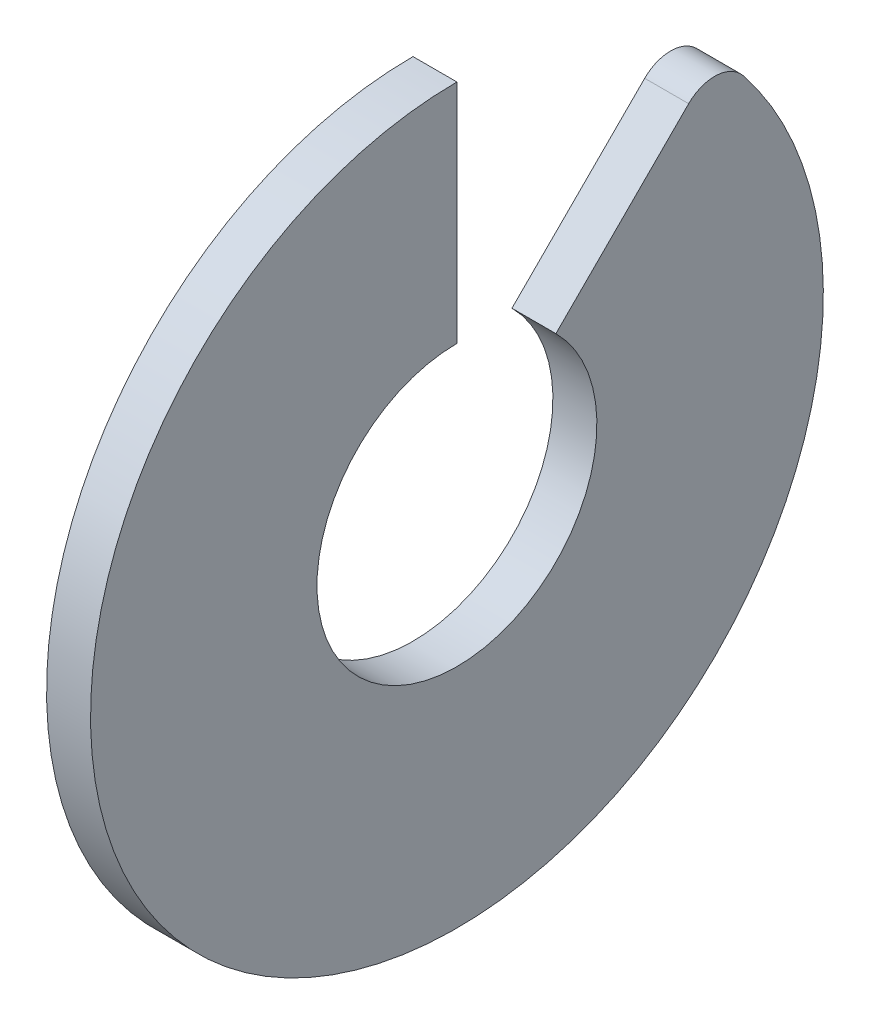
ISO-10303-21;
HEADER;
FILE_DESCRIPTION(('STEP AP214'),'2;1');
FILE_NAME('part.step','',(''),(''),'','','');
FILE_SCHEMA(('AUTOMOTIVE_DESIGN { 1 0 10303 214 1 1 1 1 }'));
ENDSEC;
DATA;
#1=APPLICATION_CONTEXT('core data for automotive mechanical design processes');
#2=APPLICATION_PROTOCOL_DEFINITION('international standard','automotive_design',2000,#1);
#3=PRODUCT_CONTEXT('',#1,'mechanical');
#4=PRODUCT('Part','Part','',(#3));
#5=PRODUCT_RELATED_PRODUCT_CATEGORY('part','',(#4));
#6=PRODUCT_DEFINITION_FORMATION('','',#4);
#7=PRODUCT_DEFINITION_CONTEXT('part definition',#1,'design');
#8=PRODUCT_DEFINITION('design','',#6,#7);
#9=PRODUCT_DEFINITION_SHAPE('','',#8);
#10=(LENGTH_UNIT() NAMED_UNIT(*) SI_UNIT(.MILLI.,.METRE.));
#11=(NAMED_UNIT(*) PLANE_ANGLE_UNIT() SI_UNIT($,.RADIAN.));
#12=(NAMED_UNIT(*) SI_UNIT($,.STERADIAN.) SOLID_ANGLE_UNIT());
#13=UNCERTAINTY_MEASURE_WITH_UNIT(LENGTH_MEASURE(1.E-05),#10,'distance_accuracy_value','');
#14=(GEOMETRIC_REPRESENTATION_CONTEXT(3) GLOBAL_UNCERTAINTY_ASSIGNED_CONTEXT((#13)) GLOBAL_UNIT_ASSIGNED_CONTEXT((#10,
#11,#12)) REPRESENTATION_CONTEXT('',''));
#15=CARTESIAN_POINT('',(0.,0.,0.));
#16=DIRECTION('',(0.,0.,1.));
#17=DIRECTION('',(1.,0.,0.));
#18=AXIS2_PLACEMENT_3D('',#15,#16,#17);
#19=CARTESIAN_POINT('',(-12.,0.,0.));
#20=DIRECTION('',(1.,0.,0.));
#21=DIRECTION('',(0.,0.,-1.));
#22=AXIS2_PLACEMENT_3D('',#19,#20,#21);
#23=CYLINDRICAL_SURFACE('',#22,38.2);
#24=CARTESIAN_POINT('',(0.,0.,0.));
#25=DIRECTION('',(-1.,0.,0.));
#26=DIRECTION('',(0.,0.,-1.));
#27=AXIS2_PLACEMENT_3D('',#24,#25,#26);
#28=CIRCLE('',#27,38.2);
#29=CARTESIAN_POINT('',(0.,27.0114790413261,-27.0114790413262));
#30=VERTEX_POINT('',#29);
#31=CARTESIAN_POINT('',(0.,38.2,0.));
#32=VERTEX_POINT('',#31);
#33=EDGE_CURVE('E128',#30,#32,#28,.T.);
#34=ORIENTED_EDGE('',*,*,#33,.F.);
#35=DIRECTION('',(1.,0.,0.));
#36=VECTOR('',#35,1.);
#37=CARTESIAN_POINT('',(-12.,27.0114790413261,-27.0114790413262));
#38=LINE('',#37,#36);
#39=CARTESIAN_POINT('',(-12.,27.0114790413261,-27.0114790413262));
#40=VERTEX_POINT('',#39);
#41=EDGE_CURVE('E115',#40,#30,#38,.T.);
#42=ORIENTED_EDGE('',*,*,#41,.F.);
#43=CARTESIAN_POINT('',(-12.,0.,0.));
#44=DIRECTION('',(-1.,0.,0.));
#45=DIRECTION('',(0.,0.,-1.));
#46=AXIS2_PLACEMENT_3D('',#43,#44,#45);
#47=CIRCLE('',#46,38.2);
#48=CARTESIAN_POINT('',(-12.,38.2,0.));
#49=VERTEX_POINT('',#48);
#50=EDGE_CURVE('E108',#40,#49,#47,.T.);
#51=ORIENTED_EDGE('',*,*,#50,.T.);
#52=DIRECTION('',(1.,0.,0.));
#53=VECTOR('',#52,1.);
#54=CARTESIAN_POINT('',(-12.,38.2,0.));
#55=LINE('',#54,#53);
#56=EDGE_CURVE('E90',#49,#32,#55,.T.);
#57=ORIENTED_EDGE('',*,*,#56,.T.);
#58=EDGE_LOOP('',(#34,#42,#51,#57));
#59=FACE_BOUND('',#58,.T.);
#60=ADVANCED_FACE('F44',(#59),#23,.F.);
#61=CARTESIAN_POINT('',(-12.,27.0114790413261,-27.0114790413262));
#62=DIRECTION('',(0.,0.707106781186549,0.707106781186546));
#63=DIRECTION('',(0.,-0.707106781186546,0.707106781186549));
#64=AXIS2_PLACEMENT_3D('',#61,#62,#63);
#65=PLANE('',#64);
#66=DIRECTION('',(0.,-0.707106781186546,0.707106781186549));
#67=VECTOR('',#66,1.);
#68=CARTESIAN_POINT('',(0.,27.0114790413261,-27.0114790413262));
#69=LINE('',#68,#67);
#70=CARTESIAN_POINT('',(0.,63.2455532033675,-63.2455532033677));
#71=VERTEX_POINT('',#70);
#72=EDGE_CURVE('E117',#71,#30,#69,.T.);
#73=ORIENTED_EDGE('',*,*,#72,.F.);
#74=DIRECTION('',(1.,0.,0.));
#75=VECTOR('',#74,1.);
#76=CARTESIAN_POINT('',(-12.,63.2455532033675,-63.2455532033677));
#77=LINE('',#76,#75);
#78=CARTESIAN_POINT('',(-12.,63.2455532033675,-63.2455532033677));
#79=VERTEX_POINT('',#78);
#80=EDGE_CURVE('E53',#71,#79,#77,.F.);
#81=ORIENTED_EDGE('',*,*,#80,.T.);
#82=DIRECTION('',(0.,-0.707106781186546,0.707106781186549));
#83=VECTOR('',#82,1.);
#84=CARTESIAN_POINT('',(-12.,27.0114790413261,-27.0114790413262));
#85=LINE('',#84,#83);
#86=EDGE_CURVE('E102',#79,#40,#85,.T.);
#87=ORIENTED_EDGE('',*,*,#86,.T.);
#88=ORIENTED_EDGE('',*,*,#41,.T.);
#89=EDGE_LOOP('',(#73,#81,#87,#88));
#90=FACE_BOUND('',#89,.T.);
#91=ADVANCED_FACE('F162',(#90),#65,.T.);
#92=CARTESIAN_POINT('',(-12.,0.,0.));
#93=DIRECTION('',(1.,0.,0.));
#94=DIRECTION('',(0.,0.,-1.));
#95=AXIS2_PLACEMENT_3D('',#92,#93,#94);
#96=CYLINDRICAL_SURFACE('',#95,100.);
#97=CARTESIAN_POINT('',(-12.,0.,0.));
#98=DIRECTION('',(1.,0.,0.));
#99=DIRECTION('',(0.,0.,-1.));
#100=AXIS2_PLACEMENT_3D('',#97,#98,#99);
#101=CIRCLE('',#100,100.);
#102=CARTESIAN_POINT('',(-12.,100.,0.));
#103=VERTEX_POINT('',#102);
#104=CARTESIAN_POINT('',(-12.,62.4160948794467,-78.1295789058146));
#105=VERTEX_POINT('',#104);
#106=EDGE_CURVE('E110',#103,#105,#101,.T.);
#107=ORIENTED_EDGE('',*,*,#106,.T.);
#108=DIRECTION('',(1.,0.,0.));
#109=VECTOR('',#108,1.);
#110=CARTESIAN_POINT('',(-12.,62.4160948794467,-78.1295789058147));
#111=LINE('',#110,#109);
#112=CARTESIAN_POINT('',(0.,62.4160948794467,-78.1295789058146));
#113=VERTEX_POINT('',#112);
#114=EDGE_CURVE('E137',#105,#113,#111,.T.);
#115=ORIENTED_EDGE('',*,*,#114,.T.);
#116=CARTESIAN_POINT('',(0.,0.,0.));
#117=DIRECTION('',(1.,0.,0.));
#118=DIRECTION('',(0.,0.,-1.));
#119=AXIS2_PLACEMENT_3D('',#116,#117,#118);
#120=CIRCLE('',#119,100.);
#121=CARTESIAN_POINT('',(0.,100.,0.));
#122=VERTEX_POINT('',#121);
#123=EDGE_CURVE('E121',#122,#113,#120,.T.);
#124=ORIENTED_EDGE('',*,*,#123,.F.);
#125=DIRECTION('',(1.,0.,0.));
#126=VECTOR('',#125,1.);
#127=CARTESIAN_POINT('',(-12.,100.,0.));
#128=LINE('',#127,#126);
#129=EDGE_CURVE('E101',#103,#122,#128,.T.);
#130=ORIENTED_EDGE('',*,*,#129,.F.);
#131=EDGE_LOOP('',(#107,#115,#124,#130));
#132=FACE_BOUND('',#131,.T.);
#133=ADVANCED_FACE('F158',(#132),#96,.T.);
#134=CARTESIAN_POINT('',(-12.,38.2,0.));
#135=DIRECTION('',(0.,0.,-1.));
#136=DIRECTION('',(0.,1.,0.));
#137=AXIS2_PLACEMENT_3D('',#134,#135,#136);
#138=PLANE('',#137);
#139=DIRECTION('',(0.,1.,0.));
#140=VECTOR('',#139,1.);
#141=CARTESIAN_POINT('',(0.,38.2,0.));
#142=LINE('',#141,#140);
#143=EDGE_CURVE('E95',#32,#122,#142,.T.);
#144=ORIENTED_EDGE('',*,*,#143,.F.);
#145=ORIENTED_EDGE('',*,*,#56,.F.);
#146=DIRECTION('',(0.,1.,0.));
#147=VECTOR('',#146,1.);
#148=CARTESIAN_POINT('',(-12.,38.2,0.));
#149=LINE('',#148,#147);
#150=EDGE_CURVE('E93',#49,#103,#149,.T.);
#151=ORIENTED_EDGE('',*,*,#150,.T.);
#152=ORIENTED_EDGE('',*,*,#129,.T.);
#153=EDGE_LOOP('',(#144,#145,#151,#152));
#154=FACE_BOUND('',#153,.T.);
#155=ADVANCED_FACE('F92',(#154),#138,.T.);
#156=CARTESIAN_POINT('',(-12.,0.,0.));
#157=DIRECTION('',(1.,0.,0.));
#158=DIRECTION('',(0.,0.,-1.));
#159=AXIS2_PLACEMENT_3D('',#156,#157,#158);
#160=PLANE('',#159);
#161=ORIENTED_EDGE('',*,*,#86,.F.);
#162=CARTESIAN_POINT('',(-12.,56.174485391502,-70.3166210152332));
#163=DIRECTION('',(1.,0.,0.));
#164=DIRECTION('',(0.,0.,-1.));
#165=AXIS2_PLACEMENT_3D('',#162,#163,#164);
#166=CIRCLE('',#165,10.);
#167=EDGE_CURVE('E11',#79,#105,#166,.F.);
#168=ORIENTED_EDGE('',*,*,#167,.T.);
#169=ORIENTED_EDGE('',*,*,#106,.F.);
#170=ORIENTED_EDGE('',*,*,#150,.F.);
#171=ORIENTED_EDGE('',*,*,#50,.F.);
#172=EDGE_LOOP('',(#161,#168,#169,#170,#171));
#173=FACE_BOUND('',#172,.T.);
#174=ADVANCED_FACE('F107',(#173),#160,.F.);
#175=CARTESIAN_POINT('',(0.,0.,0.));
#176=DIRECTION('',(1.,0.,0.));
#177=DIRECTION('',(0.,0.,-1.));
#178=AXIS2_PLACEMENT_3D('',#175,#176,#177);
#179=PLANE('',#178);
#180=ORIENTED_EDGE('',*,*,#123,.T.);
#181=CARTESIAN_POINT('',(0.,56.174485391502,-70.3166210152332));
#182=DIRECTION('',(1.,0.,0.));
#183=DIRECTION('',(0.,0.,-1.));
#184=AXIS2_PLACEMENT_3D('',#181,#182,#183);
#185=CIRCLE('',#184,10.);
#186=EDGE_CURVE('E67',#113,#71,#185,.T.);
#187=ORIENTED_EDGE('',*,*,#186,.T.);
#188=ORIENTED_EDGE('',*,*,#72,.T.);
#189=ORIENTED_EDGE('',*,*,#33,.T.);
#190=ORIENTED_EDGE('',*,*,#143,.T.);
#191=EDGE_LOOP('',(#180,#187,#188,#189,#190));
#192=FACE_BOUND('',#191,.T.);
#193=ADVANCED_FACE('F161',(#192),#179,.T.);
#194=CARTESIAN_POINT('',(-12.,56.174485391502,-70.3166210152332));
#195=DIRECTION('',(1.,0.,0.));
#196=DIRECTION('',(0.,0.,-1.));
#197=AXIS2_PLACEMENT_3D('',#194,#195,#196);
#198=CYLINDRICAL_SURFACE('',#197,10.);
#199=ORIENTED_EDGE('',*,*,#167,.F.);
#200=ORIENTED_EDGE('',*,*,#80,.F.);
#201=ORIENTED_EDGE('',*,*,#186,.F.);
#202=ORIENTED_EDGE('',*,*,#114,.F.);
#203=EDGE_LOOP('',(#199,#200,#201,#202));
#204=FACE_BOUND('',#203,.T.);
#205=ADVANCED_FACE('F46',(#204),#198,.T.);
#206=CLOSED_SHELL('',(#60,#91,#133,#155,#174,#193,#205));
#207=MANIFOLD_SOLID_BREP('B2',#206);
#208=ADVANCED_BREP_SHAPE_REPRESENTATION('',(#18,#207),#14);
#209=SHAPE_DEFINITION_REPRESENTATION(#9,#208);
ENDSEC;
END-ISO-10303-21;
